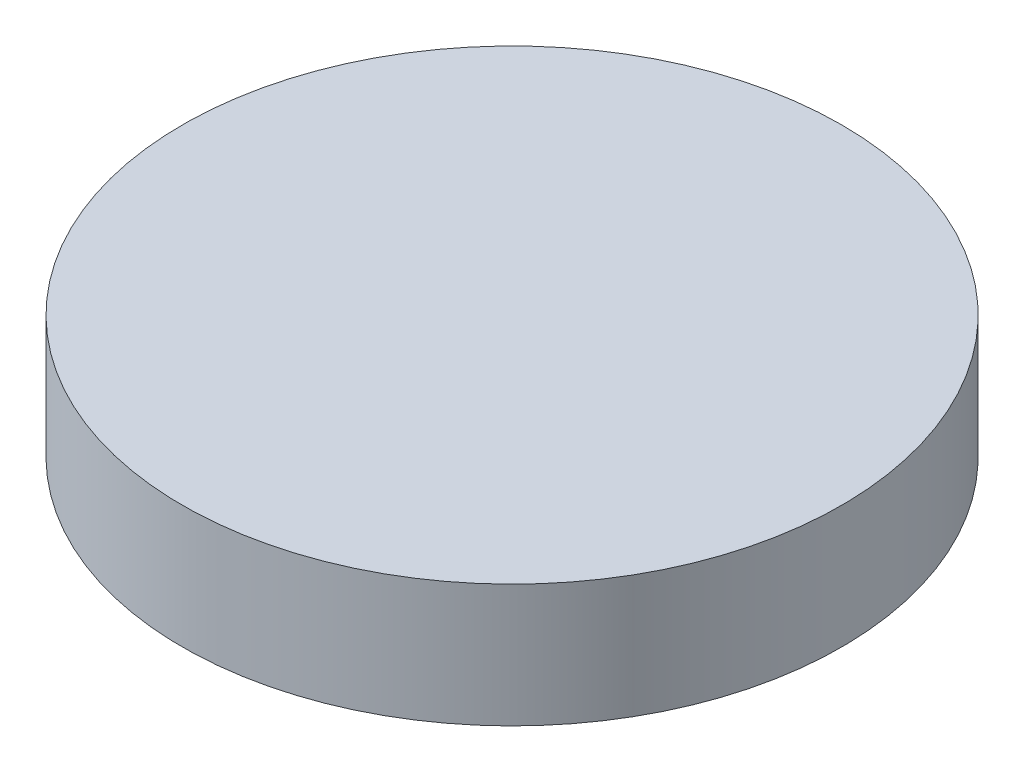
ISO-10303-21;
HEADER;
FILE_DESCRIPTION(('STEP AP214'),'2;1');
FILE_NAME('part.step','',(''),(''),'','','');
FILE_SCHEMA(('AUTOMOTIVE_DESIGN { 1 0 10303 214 1 1 1 1 }'));
ENDSEC;
DATA;
#1=APPLICATION_CONTEXT('core data for automotive mechanical design processes');
#2=APPLICATION_PROTOCOL_DEFINITION('international standard','automotive_design',2000,#1);
#3=PRODUCT_CONTEXT('',#1,'mechanical');
#4=PRODUCT('Part','Part','',(#3));
#5=PRODUCT_RELATED_PRODUCT_CATEGORY('part','',(#4));
#6=PRODUCT_DEFINITION_FORMATION('','',#4);
#7=PRODUCT_DEFINITION_CONTEXT('part definition',#1,'design');
#8=PRODUCT_DEFINITION('design','',#6,#7);
#9=PRODUCT_DEFINITION_SHAPE('','',#8);
#10=(LENGTH_UNIT() NAMED_UNIT(*) SI_UNIT(.MILLI.,.METRE.));
#11=(NAMED_UNIT(*) PLANE_ANGLE_UNIT() SI_UNIT($,.RADIAN.));
#12=(NAMED_UNIT(*) SI_UNIT($,.STERADIAN.) SOLID_ANGLE_UNIT());
#13=UNCERTAINTY_MEASURE_WITH_UNIT(LENGTH_MEASURE(1.E-05),#10,'distance_accuracy_value','');
#14=(GEOMETRIC_REPRESENTATION_CONTEXT(3) GLOBAL_UNCERTAINTY_ASSIGNED_CONTEXT((#13)) GLOBAL_UNIT_ASSIGNED_CONTEXT((#10,
#11,#12)) REPRESENTATION_CONTEXT('',''));
#15=CARTESIAN_POINT('',(0.,0.,0.));
#16=DIRECTION('',(0.,0.,1.));
#17=DIRECTION('',(1.,0.,0.));
#18=AXIS2_PLACEMENT_3D('',#15,#16,#17);
#19=CARTESIAN_POINT('',(0.,19.05,0.));
#20=DIRECTION('',(0.,-1.,0.));
#21=DIRECTION('',(0.,0.,-1.));
#22=AXIS2_PLACEMENT_3D('',#19,#20,#21);
#23=CYLINDRICAL_SURFACE('',#22,51.1302);
#24=CARTESIAN_POINT('',(0.,19.05,0.));
#25=DIRECTION('',(0.,1.,0.));
#26=DIRECTION('',(0.,0.,1.));
#27=AXIS2_PLACEMENT_3D('',#24,#25,#26);
#28=CIRCLE('',#27,51.1302);
#29=CARTESIAN_POINT('',(0.,19.05,-51.1302));
#30=VERTEX_POINT('',#29);
#31=EDGE_CURVE('E10',#30,#30,#28,.T.);
#32=CARTESIAN_POINT('',(0.,0.,0.));
#33=DIRECTION('',(0.,1.,0.));
#34=DIRECTION('',(0.,0.,1.));
#35=AXIS2_PLACEMENT_3D('',#32,#33,#34);
#36=CIRCLE('',#35,51.1302);
#37=CARTESIAN_POINT('',(0.,0.,-51.1302));
#38=VERTEX_POINT('',#37);
#39=EDGE_CURVE('E44',#38,#38,#36,.T.);
#40=CARTESIAN_POINT('',(0.,19.05,-51.1302));
#41=CARTESIAN_POINT('',(0.,18.8515625,-51.1302));
#42=CARTESIAN_POINT('',(0.,18.653125,-51.1302));
#43=CARTESIAN_POINT('',(0.,18.25625,-51.1302));
#44=CARTESIAN_POINT('',(0.,18.0578125,-51.1302));
#45=CARTESIAN_POINT('',(0.,17.6609375,-51.1302));
#46=CARTESIAN_POINT('',(0.,17.4625,-51.1302));
#47=CARTESIAN_POINT('',(0.,17.065625,-51.1302));
#48=CARTESIAN_POINT('',(0.,16.8671875,-51.1302));
#49=CARTESIAN_POINT('',(0.,16.4703125,-51.1302));
#50=CARTESIAN_POINT('',(0.,16.271875,-51.1302));
#51=CARTESIAN_POINT('',(0.,15.875,-51.1302));
#52=CARTESIAN_POINT('',(0.,15.6765625,-51.1302));
#53=CARTESIAN_POINT('',(0.,15.2796875,-51.1302));
#54=CARTESIAN_POINT('',(0.,15.08125,-51.1302));
#55=CARTESIAN_POINT('',(0.,14.684375,-51.1302));
#56=CARTESIAN_POINT('',(0.,14.4859375,-51.1302));
#57=CARTESIAN_POINT('',(0.,14.0890625,-51.1302));
#58=CARTESIAN_POINT('',(0.,13.890625,-51.1302));
#59=CARTESIAN_POINT('',(0.,13.49375,-51.1302));
#60=CARTESIAN_POINT('',(0.,13.2953125,-51.1302));
#61=CARTESIAN_POINT('',(0.,12.8984375,-51.1302));
#62=CARTESIAN_POINT('',(0.,12.7,-51.1302));
#63=CARTESIAN_POINT('',(0.,12.303125,-51.1302));
#64=CARTESIAN_POINT('',(0.,12.1046875,-51.1302));
#65=CARTESIAN_POINT('',(0.,11.7078125,-51.1302));
#66=CARTESIAN_POINT('',(0.,11.509375,-51.1302));
#67=CARTESIAN_POINT('',(0.,11.1125,-51.1302));
#68=CARTESIAN_POINT('',(0.,10.9140625,-51.1302));
#69=CARTESIAN_POINT('',(0.,10.5171875,-51.1302));
#70=CARTESIAN_POINT('',(0.,10.31875,-51.1302));
#71=CARTESIAN_POINT('',(0.,9.921875,-51.1302));
#72=CARTESIAN_POINT('',(0.,9.7234375,-51.1302));
#73=CARTESIAN_POINT('',(0.,9.3265625,-51.1302));
#74=CARTESIAN_POINT('',(0.,9.128125,-51.1302));
#75=CARTESIAN_POINT('',(0.,8.73125,-51.1302));
#76=CARTESIAN_POINT('',(0.,8.5328125,-51.1302));
#77=CARTESIAN_POINT('',(0.,8.1359375,-51.1302));
#78=CARTESIAN_POINT('',(0.,7.9375,-51.1302));
#79=CARTESIAN_POINT('',(0.,7.540625,-51.1302));
#80=CARTESIAN_POINT('',(0.,7.3421875,-51.1302));
#81=CARTESIAN_POINT('',(0.,6.9453125,-51.1302));
#82=CARTESIAN_POINT('',(0.,6.746875,-51.1302));
#83=CARTESIAN_POINT('',(0.,6.35,-51.1302));
#84=CARTESIAN_POINT('',(0.,6.1515625,-51.1302));
#85=CARTESIAN_POINT('',(0.,5.7546875,-51.1302));
#86=CARTESIAN_POINT('',(0.,5.55625,-51.1302));
#87=CARTESIAN_POINT('',(0.,5.159375,-51.1302));
#88=CARTESIAN_POINT('',(0.,4.9609375,-51.1302));
#89=CARTESIAN_POINT('',(0.,4.5640625,-51.1302));
#90=CARTESIAN_POINT('',(0.,4.365625,-51.1302));
#91=CARTESIAN_POINT('',(0.,3.96875,-51.1302));
#92=CARTESIAN_POINT('',(0.,3.7703125,-51.1302));
#93=CARTESIAN_POINT('',(0.,3.3734375,-51.1302));
#94=CARTESIAN_POINT('',(0.,3.175,-51.1302));
#95=CARTESIAN_POINT('',(0.,2.778125,-51.1302));
#96=CARTESIAN_POINT('',(0.,2.5796875,-51.1302));
#97=CARTESIAN_POINT('',(0.,2.1828125,-51.1302));
#98=CARTESIAN_POINT('',(0.,1.984375,-51.1302));
#99=CARTESIAN_POINT('',(0.,1.5875,-51.1302));
#100=CARTESIAN_POINT('',(0.,1.3890625,-51.1302));
#101=CARTESIAN_POINT('',(0.,0.992187500000001,-51.1302));
#102=CARTESIAN_POINT('',(0.,0.793750000000001,-51.1302));
#103=CARTESIAN_POINT('',(0.,0.396875,-51.1302));
#104=CARTESIAN_POINT('',(0.,0.1984375,-51.1302));
#105=CARTESIAN_POINT('',(0.,0.,-51.1302));
#106=B_SPLINE_CURVE_WITH_KNOTS('',3,(#40,#41,#42,#43,#44,#45,#46,#47,#48,#49,#50,#51,#52,#53,
#54,#55,#56,#57,#58,#59,#60,#61,#62,#63,#64,#65,#66,#67,#68,#69,#70,#71,#72,#73,#74,#75,#76,#77,
#78,#79,#80,#81,#82,#83,#84,#85,#86,#87,#88,#89,#90,#91,#92,#93,#94,#95,#96,#97,#98,#99,#100,
#101,#102,#103,#104,#105),.UNSPECIFIED.,.F.,.F.,(4,2,2,2,2,2,2,2,2,2,2,2,2,2,2,2,2,2,2,2,2,2,2,
2,2,2,2,2,2,2,2,2,4),(0.,0.595312499999997,1.190625,1.7859375,2.38125,2.9765625,3.571875,
4.1671875,4.7625,5.3578125,5.953125,6.5484375,7.14375,7.7390625,8.334375,8.9296875,9.525,
10.1203125,10.715625,11.3109375,11.90625,12.5015625,13.096875,13.6921875,14.2875,14.8828125,
15.478125,16.0734375,16.66875,17.2640625,17.859375,18.4546875,19.05),.UNSPECIFIED.);
#107=EDGE_CURVE('BSEAM41',#30,#38,#106,.T.);
#108=ORIENTED_EDGE('',*,*,#31,.F.);
#109=ORIENTED_EDGE('',*,*,#39,.T.);
#110=ORIENTED_EDGE('',*,*,#107,.T.);
#111=ORIENTED_EDGE('',*,*,#107,.F.);
#112=EDGE_LOOP('',(#108,#110,#109,#111));
#113=FACE_BOUND('',#112,.T.);
#114=ADVANCED_FACE('F41',(#113),#23,.T.);
#115=CARTESIAN_POINT('',(0.,19.05,0.));
#116=DIRECTION('',(0.,1.,0.));
#117=DIRECTION('',(0.,0.,1.));
#118=AXIS2_PLACEMENT_3D('',#115,#116,#117);
#119=PLANE('',#118);
#120=ORIENTED_EDGE('',*,*,#31,.T.);
#121=EDGE_LOOP('',(#120));
#122=FACE_BOUND('',#121,.T.);
#123=ADVANCED_FACE('F58',(#122),#119,.T.);
#124=CARTESIAN_POINT('',(0.,0.,0.));
#125=DIRECTION('',(0.,1.,0.));
#126=DIRECTION('',(0.,0.,1.));
#127=AXIS2_PLACEMENT_3D('',#124,#125,#126);
#128=PLANE('',#127);
#129=ORIENTED_EDGE('',*,*,#39,.F.);
#130=EDGE_LOOP('',(#129));
#131=FACE_BOUND('',#130,.T.);
#132=ADVANCED_FACE('F56',(#131),#128,.F.);
#133=CLOSED_SHELL('',(#114,#123,#132));
#134=MANIFOLD_SOLID_BREP('B2',#133);
#135=ADVANCED_BREP_SHAPE_REPRESENTATION('',(#18,#134),#14);
#136=SHAPE_DEFINITION_REPRESENTATION(#9,#135);
ENDSEC;
END-ISO-10303-21;
